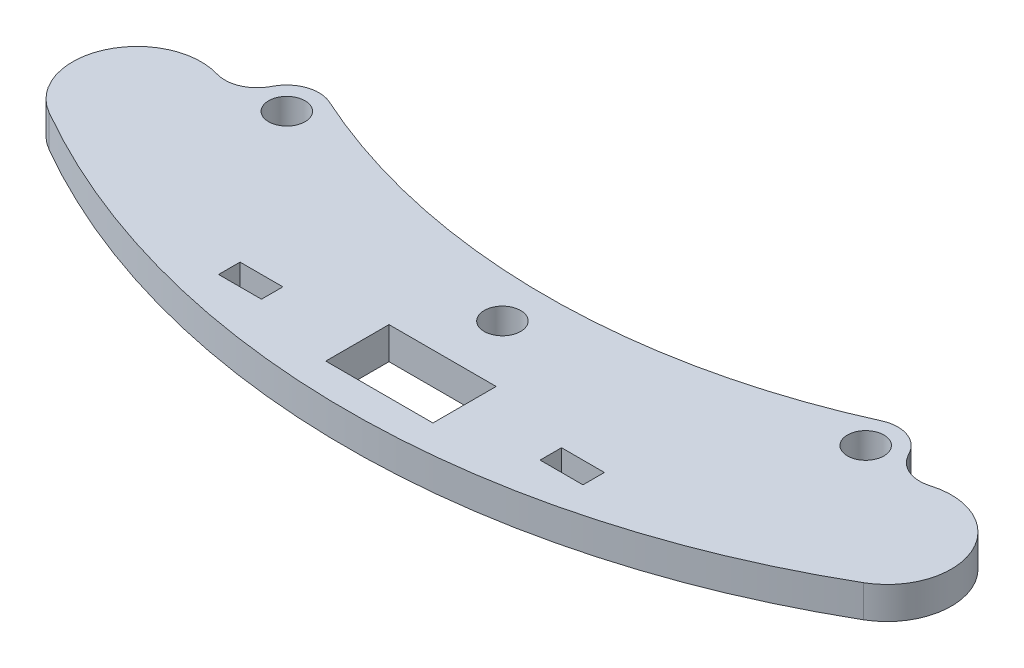
ISO-10303-21;
HEADER;
FILE_DESCRIPTION(('STEP AP214'),'2;1');
FILE_NAME('part.step','',(''),(''),'','','');
FILE_SCHEMA(('AUTOMOTIVE_DESIGN { 1 0 10303 214 1 1 1 1 }'));
ENDSEC;
DATA;
#1=APPLICATION_CONTEXT('core data for automotive mechanical design processes');
#2=APPLICATION_PROTOCOL_DEFINITION('international standard','automotive_design',2000,#1);
#3=PRODUCT_CONTEXT('',#1,'mechanical');
#4=PRODUCT('Part','Part','',(#3));
#5=PRODUCT_RELATED_PRODUCT_CATEGORY('part','',(#4));
#6=PRODUCT_DEFINITION_FORMATION('','',#4);
#7=PRODUCT_DEFINITION_CONTEXT('part definition',#1,'design');
#8=PRODUCT_DEFINITION('design','',#6,#7);
#9=PRODUCT_DEFINITION_SHAPE('','',#8);
#10=(LENGTH_UNIT() NAMED_UNIT(*) SI_UNIT(.MILLI.,.METRE.));
#11=(NAMED_UNIT(*) PLANE_ANGLE_UNIT() SI_UNIT($,.RADIAN.));
#12=(NAMED_UNIT(*) SI_UNIT($,.STERADIAN.) SOLID_ANGLE_UNIT());
#13=UNCERTAINTY_MEASURE_WITH_UNIT(LENGTH_MEASURE(1.E-05),#10,'distance_accuracy_value','');
#14=(GEOMETRIC_REPRESENTATION_CONTEXT(3) GLOBAL_UNCERTAINTY_ASSIGNED_CONTEXT((#13)) GLOBAL_UNIT_ASSIGNED_CONTEXT((#10,
#11,#12)) REPRESENTATION_CONTEXT('',''));
#15=CARTESIAN_POINT('',(0.,0.,0.));
#16=DIRECTION('',(0.,0.,1.));
#17=DIRECTION('',(1.,0.,0.));
#18=AXIS2_PLACEMENT_3D('',#15,#16,#17);
#19=CARTESIAN_POINT('',(-34.9999999999997,3.,60.6217782649109));
#20=DIRECTION('',(0.,1.,0.));
#21=DIRECTION('',(0.,0.,1.));
#22=AXIS2_PLACEMENT_3D('',#19,#20,#21);
#23=PLANE('',#22);
#24=DIRECTION('',(-1.,0.,0.));
#25=VECTOR('',#24,1.);
#26=CARTESIAN_POINT('',(17.0000000000005,3.,71.0000000000001));
#27=LINE('',#26,#25);
#28=CARTESIAN_POINT('',(17.0000000000005,3.,71.0000000000001));
#29=VERTEX_POINT('',#28);
#30=CARTESIAN_POINT('',(13.0000000000005,3.,71.0000000000001));
#31=VERTEX_POINT('',#30);
#32=EDGE_CURVE('E226',#29,#31,#27,.T.);
#33=ORIENTED_EDGE('',*,*,#32,.T.);
#34=DIRECTION('',(0.,0.,-1.));
#35=VECTOR('',#34,1.);
#36=CARTESIAN_POINT('',(13.0000000000005,3.,71.0000000000001));
#37=LINE('',#36,#35);
#38=CARTESIAN_POINT('',(13.0000000000005,3.,69.0000000000001));
#39=VERTEX_POINT('',#38);
#40=EDGE_CURVE('E242',#31,#39,#37,.T.);
#41=ORIENTED_EDGE('',*,*,#40,.T.);
#42=DIRECTION('',(1.,0.,0.));
#43=VECTOR('',#42,1.);
#44=CARTESIAN_POINT('',(17.0000000000005,3.,69.0000000000001));
#45=LINE('',#44,#43);
#46=CARTESIAN_POINT('',(17.0000000000005,3.,69.0000000000001));
#47=VERTEX_POINT('',#46);
#48=EDGE_CURVE('E220',#39,#47,#45,.T.);
#49=ORIENTED_EDGE('',*,*,#48,.T.);
#50=DIRECTION('',(0.,0.,1.));
#51=VECTOR('',#50,1.);
#52=CARTESIAN_POINT('',(17.0000000000005,3.,71.0000000000001));
#53=LINE('',#52,#51);
#54=EDGE_CURVE('E223',#47,#29,#53,.T.);
#55=ORIENTED_EDGE('',*,*,#54,.T.);
#56=EDGE_LOOP('',(#33,#41,#49,#55));
#57=FACE_BOUND('',#56,.T.);
#58=DIRECTION('',(0.,0.,1.));
#59=VECTOR('',#58,1.);
#60=CARTESIAN_POINT('',(-13.,3.,71.));
#61=LINE('',#60,#59);
#62=CARTESIAN_POINT('',(-13.,3.,69.));
#63=VERTEX_POINT('',#62);
#64=CARTESIAN_POINT('',(-13.,3.,71.));
#65=VERTEX_POINT('',#64);
#66=EDGE_CURVE('E194',#63,#65,#61,.T.);
#67=ORIENTED_EDGE('',*,*,#66,.T.);
#68=DIRECTION('',(-1.,0.,0.));
#69=VECTOR('',#68,1.);
#70=CARTESIAN_POINT('',(-17.,3.,71.));
#71=LINE('',#70,#69);
#72=CARTESIAN_POINT('',(-17.,3.,71.));
#73=VERTEX_POINT('',#72);
#74=EDGE_CURVE('E181',#65,#73,#71,.T.);
#75=ORIENTED_EDGE('',*,*,#74,.T.);
#76=DIRECTION('',(0.,0.,-1.));
#77=VECTOR('',#76,1.);
#78=CARTESIAN_POINT('',(-17.,3.,71.));
#79=LINE('',#78,#77);
#80=CARTESIAN_POINT('',(-17.,3.,69.));
#81=VERTEX_POINT('',#80);
#82=EDGE_CURVE('E206',#73,#81,#79,.T.);
#83=ORIENTED_EDGE('',*,*,#82,.T.);
#84=DIRECTION('',(1.,0.,0.));
#85=VECTOR('',#84,1.);
#86=CARTESIAN_POINT('',(-17.,3.,69.));
#87=LINE('',#86,#85);
#88=EDGE_CURVE('E202',#81,#63,#87,.T.);
#89=ORIENTED_EDGE('',*,*,#88,.T.);
#90=EDGE_LOOP('',(#67,#75,#83,#89));
#91=FACE_BOUND('',#90,.T.);
#92=DIRECTION('',(0.,0.,1.));
#93=VECTOR('',#92,1.);
#94=CARTESIAN_POINT('',(5.00000000000026,3.,73.));
#95=LINE('',#94,#93);
#96=CARTESIAN_POINT('',(5.00000000000026,3.,67.1));
#97=VERTEX_POINT('',#96);
#98=CARTESIAN_POINT('',(5.00000000000026,3.,73.));
#99=VERTEX_POINT('',#98);
#100=EDGE_CURVE('E255',#97,#99,#95,.T.);
#101=ORIENTED_EDGE('',*,*,#100,.T.);
#102=DIRECTION('',(-1.,0.,0.));
#103=VECTOR('',#102,1.);
#104=CARTESIAN_POINT('',(-4.99999999999974,3.,73.));
#105=LINE('',#104,#103);
#106=CARTESIAN_POINT('',(-4.99999999999973,3.,73.));
#107=VERTEX_POINT('',#106);
#108=EDGE_CURVE('E272',#99,#107,#105,.T.);
#109=ORIENTED_EDGE('',*,*,#108,.T.);
#110=DIRECTION('',(0.,0.,-1.));
#111=VECTOR('',#110,1.);
#112=CARTESIAN_POINT('',(-4.99999999999974,3.,73.));
#113=LINE('',#112,#111);
#114=CARTESIAN_POINT('',(-4.99999999999974,3.,67.1));
#115=VERTEX_POINT('',#114);
#116=EDGE_CURVE('E189',#107,#115,#113,.T.);
#117=ORIENTED_EDGE('',*,*,#116,.T.);
#118=DIRECTION('',(1.,0.,0.));
#119=VECTOR('',#118,1.);
#120=CARTESIAN_POINT('',(-4.99999999999974,3.,67.1));
#121=LINE('',#120,#119);
#122=EDGE_CURVE('E252',#115,#97,#121,.T.);
#123=ORIENTED_EDGE('',*,*,#122,.T.);
#124=EDGE_LOOP('',(#101,#109,#117,#123));
#125=FACE_BOUND('',#124,.T.);
#126=CARTESIAN_POINT('',(-4.19109191795997E-12,3.,61.5151302624379));
#127=DIRECTION('',(0.,1.,0.));
#128=DIRECTION('',(0.,0.,1.));
#129=AXIS2_PLACEMENT_3D('',#126,#127,#128);
#130=CIRCLE('',#129,1.70000000000389);
#131=CARTESIAN_POINT('',(-4.19109191795997E-12,3.,63.2151302624418));
#132=VERTEX_POINT('',#131);
#133=EDGE_CURVE('E288',#132,#132,#130,.T.);
#134=ORIENTED_EDGE('',*,*,#133,.F.);
#135=EDGE_LOOP('',(#134));
#136=FACE_BOUND('',#135,.T.);
#137=CARTESIAN_POINT('',(-34.9999999999997,3.,60.6217782649109));
#138=DIRECTION('',(0.,1.,0.));
#139=DIRECTION('',(0.,0.,1.));
#140=AXIS2_PLACEMENT_3D('',#137,#138,#139);
#141=CIRCLE('',#140,6.00000000000001);
#142=CARTESIAN_POINT('',(-33.2800865650844,3.,54.8735700417862));
#143=VERTEX_POINT('',#142);
#144=CARTESIAN_POINT('',(-37.9999999999997,3.,65.8179306876175));
#145=VERTEX_POINT('',#144);
#146=EDGE_CURVE('E300',#143,#145,#141,.T.);
#147=ORIENTED_EDGE('',*,*,#146,.T.);
#148=CARTESIAN_POINT('',(0.,3.,2.42861286636753E-13));
#149=DIRECTION('',(0.,1.,0.));
#150=DIRECTION('',(0.,0.,1.));
#151=AXIS2_PLACEMENT_3D('',#148,#149,#150);
#152=CIRCLE('',#151,75.9999999999998);
#153=CARTESIAN_POINT('',(38.0000000000001,3.,65.8179306876173));
#154=VERTEX_POINT('',#153);
#155=EDGE_CURVE('E303',#145,#154,#152,.T.);
#156=ORIENTED_EDGE('',*,*,#155,.T.);
#157=CARTESIAN_POINT('',(35.0000000000001,3.,60.6217782649107));
#158=DIRECTION('',(0.,1.,0.));
#159=DIRECTION('',(0.,0.,1.));
#160=AXIS2_PLACEMENT_3D('',#157,#158,#159);
#161=CIRCLE('',#160,6.);
#162=CARTESIAN_POINT('',(33.2800865650846,3.,54.873570041786));
#163=VERTEX_POINT('',#162);
#164=EDGE_CURVE('E306',#154,#163,#161,.T.);
#165=ORIENTED_EDGE('',*,*,#164,.T.);
#166=CARTESIAN_POINT('',(32.4201298476269,3.,51.9994659302237));
#167=DIRECTION('',(0.,-1.,0.));
#168=DIRECTION('',(0.,0.,1.));
#169=AXIS2_PLACEMENT_3D('',#166,#167,#168);
#170=CIRCLE('',#169,3.);
#171=CARTESIAN_POINT('',(29.8220536362736,3.,53.4994659302238));
#172=VERTEX_POINT('',#171);
#173=EDGE_CURVE('E308',#163,#172,#170,.T.);
#174=ORIENTED_EDGE('',*,*,#173,.T.);
#175=DIRECTION('',(-0.499999999999996,0.,-0.866025403784441));
#176=VECTOR('',#175,1.);
#177=CARTESIAN_POINT('',(29.6071078981258,3.,53.1271689908813));
#178=LINE('',#177,#176);
#179=CARTESIAN_POINT('',(29.6071078981258,3.,53.1271689908813));
#180=VERTEX_POINT('',#179);
#181=EDGE_CURVE('E310',#172,#180,#178,.T.);
#182=ORIENTED_EDGE('',*,*,#181,.T.);
#183=CARTESIAN_POINT('',(27.0090316867723,3.,54.6271689908816));
#184=DIRECTION('',(0.,1.,0.));
#185=DIRECTION('',(0.,0.,1.));
#186=AXIS2_PLACEMENT_3D('',#183,#184,#185);
#187=CIRCLE('',#186,3.00000000000026);
#188=CARTESIAN_POINT('',(25.8239032892173,3.,51.8711808411774));
#189=VERTEX_POINT('',#188);
#190=EDGE_CURVE('E312',#180,#189,#187,.T.);
#191=ORIENTED_EDGE('',*,*,#190,.T.);
#192=CARTESIAN_POINT('',(1.24390822984244E-13,3.,-5.00852889084444));
#193=DIRECTION('',(0.,-1.,0.));
#194=DIRECTION('',(0.,0.,1.));
#195=AXIS2_PLACEMENT_3D('',#192,#193,#194);
#196=CIRCLE('',#195,62.4673943773061);
#197=CARTESIAN_POINT('',(-25.8239032892168,3.,51.8711808411775));
#198=VERTEX_POINT('',#197);
#199=EDGE_CURVE('E314',#189,#198,#196,.T.);
#200=ORIENTED_EDGE('',*,*,#199,.T.);
#201=CARTESIAN_POINT('',(-27.0090316867729,3.,54.6271689908812));
#202=DIRECTION('',(0.,1.,0.));
#203=DIRECTION('',(0.,0.,-1.));
#204=AXIS2_PLACEMENT_3D('',#201,#202,#203);
#205=CIRCLE('',#204,3.00000000000005);
#206=CARTESIAN_POINT('',(-29.6071078981262,3.,53.1271689908811));
#207=VERTEX_POINT('',#206);
#208=EDGE_CURVE('E316',#198,#207,#205,.T.);
#209=ORIENTED_EDGE('',*,*,#208,.T.);
#210=DIRECTION('',(-0.500000000000002,0.,0.866025403784438));
#211=VECTOR('',#210,1.);
#212=CARTESIAN_POINT('',(-29.607107898126,3.,53.1271689908812));
#213=LINE('',#212,#211);
#214=CARTESIAN_POINT('',(-29.8220536362738,3.,53.4994659302235));
#215=VERTEX_POINT('',#214);
#216=EDGE_CURVE('E318',#207,#215,#213,.T.);
#217=ORIENTED_EDGE('',*,*,#216,.T.);
#218=CARTESIAN_POINT('',(-32.4201298476273,3.,51.9994659302236));
#219=DIRECTION('',(0.,-1.,0.));
#220=DIRECTION('',(0.,0.,-1.));
#221=AXIS2_PLACEMENT_3D('',#218,#219,#220);
#222=CIRCLE('',#221,3.00000000000014);
#223=EDGE_CURVE('E320',#215,#143,#222,.T.);
#224=ORIENTED_EDGE('',*,*,#223,.T.);
#225=EDGE_LOOP('',(#147,#156,#165,#174,#182,#191,#200,#209,#217,#224));
#226=FACE_BOUND('',#225,.T.);
#227=CARTESIAN_POINT('',(27.0090316867723,3.,54.6271689908816));
#228=DIRECTION('',(0.,1.,0.));
#229=DIRECTION('',(0.,0.,1.));
#230=AXIS2_PLACEMENT_3D('',#227,#228,#229);
#231=CIRCLE('',#230,1.70000000000025);
#232=CARTESIAN_POINT('',(27.0090316867723,3.,56.3271689908819));
#233=VERTEX_POINT('',#232);
#234=EDGE_CURVE('E294',#233,#233,#231,.T.);
#235=ORIENTED_EDGE('',*,*,#234,.F.);
#236=EDGE_LOOP('',(#235));
#237=FACE_BOUND('',#236,.T.);
#238=CARTESIAN_POINT('',(-27.0090316867729,3.,54.6271689908812));
#239=DIRECTION('',(0.,1.,0.));
#240=DIRECTION('',(0.,0.,1.));
#241=AXIS2_PLACEMENT_3D('',#238,#239,#240);
#242=CIRCLE('',#241,1.70000000000025);
#243=CARTESIAN_POINT('',(-27.0090316867729,3.,56.3271689908814));
#244=VERTEX_POINT('',#243);
#245=EDGE_CURVE('E282',#244,#244,#242,.T.);
#246=ORIENTED_EDGE('',*,*,#245,.F.);
#247=EDGE_LOOP('',(#246));
#248=FACE_BOUND('',#247,.T.);
#249=ADVANCED_FACE('F33',(#57,#91,#125,#136,#226,#237,#248),#23,.T.);
#250=CARTESIAN_POINT('',(-34.9999999999997,0.,60.6217782649109));
#251=DIRECTION('',(0.,1.,0.));
#252=DIRECTION('',(0.,0.,1.));
#253=AXIS2_PLACEMENT_3D('',#250,#251,#252);
#254=PLANE('',#253);
#255=DIRECTION('',(0.,0.,-1.));
#256=VECTOR('',#255,1.);
#257=CARTESIAN_POINT('',(13.0000000000005,0.,71.0000000000001));
#258=LINE('',#257,#256);
#259=CARTESIAN_POINT('',(13.0000000000005,0.,71.0000000000001));
#260=VERTEX_POINT('',#259);
#261=CARTESIAN_POINT('',(13.0000000000005,0.,69.0000000000001));
#262=VERTEX_POINT('',#261);
#263=EDGE_CURVE('E231',#260,#262,#258,.T.);
#264=ORIENTED_EDGE('',*,*,#263,.F.);
#265=DIRECTION('',(-1.,0.,0.));
#266=VECTOR('',#265,1.);
#267=CARTESIAN_POINT('',(17.0000000000005,0.,71.0000000000001));
#268=LINE('',#267,#266);
#269=CARTESIAN_POINT('',(17.0000000000005,0.,71.0000000000001));
#270=VERTEX_POINT('',#269);
#271=EDGE_CURVE('E229',#270,#260,#268,.T.);
#272=ORIENTED_EDGE('',*,*,#271,.F.);
#273=DIRECTION('',(0.,0.,1.));
#274=VECTOR('',#273,1.);
#275=CARTESIAN_POINT('',(17.0000000000005,0.,71.0000000000001));
#276=LINE('',#275,#274);
#277=CARTESIAN_POINT('',(17.0000000000005,0.,69.0000000000001));
#278=VERTEX_POINT('',#277);
#279=EDGE_CURVE('E236',#278,#270,#276,.T.);
#280=ORIENTED_EDGE('',*,*,#279,.F.);
#281=DIRECTION('',(1.,0.,0.));
#282=VECTOR('',#281,1.);
#283=CARTESIAN_POINT('',(17.0000000000005,0.,69.0000000000001));
#284=LINE('',#283,#282);
#285=EDGE_CURVE('E233',#262,#278,#284,.T.);
#286=ORIENTED_EDGE('',*,*,#285,.F.);
#287=EDGE_LOOP('',(#264,#272,#280,#286));
#288=FACE_BOUND('',#287,.T.);
#289=DIRECTION('',(-1.,0.,0.));
#290=VECTOR('',#289,1.);
#291=CARTESIAN_POINT('',(-17.,0.,71.));
#292=LINE('',#291,#290);
#293=CARTESIAN_POINT('',(-13.,0.,71.));
#294=VERTEX_POINT('',#293);
#295=CARTESIAN_POINT('',(-17.,0.,71.));
#296=VERTEX_POINT('',#295);
#297=EDGE_CURVE('E204',#294,#296,#292,.T.);
#298=ORIENTED_EDGE('',*,*,#297,.F.);
#299=DIRECTION('',(0.,0.,1.));
#300=VECTOR('',#299,1.);
#301=CARTESIAN_POINT('',(-13.,0.,71.));
#302=LINE('',#301,#300);
#303=CARTESIAN_POINT('',(-13.,0.,69.));
#304=VERTEX_POINT('',#303);
#305=EDGE_CURVE('E197',#304,#294,#302,.T.);
#306=ORIENTED_EDGE('',*,*,#305,.F.);
#307=DIRECTION('',(1.,0.,0.));
#308=VECTOR('',#307,1.);
#309=CARTESIAN_POINT('',(-17.,0.,69.));
#310=LINE('',#309,#308);
#311=CARTESIAN_POINT('',(-17.,0.,69.));
#312=VERTEX_POINT('',#311);
#313=EDGE_CURVE('E198',#312,#304,#310,.T.);
#314=ORIENTED_EDGE('',*,*,#313,.F.);
#315=DIRECTION('',(0.,0.,-1.));
#316=VECTOR('',#315,1.);
#317=CARTESIAN_POINT('',(-17.,0.,71.));
#318=LINE('',#317,#316);
#319=EDGE_CURVE('E211',#296,#312,#318,.T.);
#320=ORIENTED_EDGE('',*,*,#319,.F.);
#321=EDGE_LOOP('',(#298,#306,#314,#320));
#322=FACE_BOUND('',#321,.T.);
#323=DIRECTION('',(-1.,0.,0.));
#324=VECTOR('',#323,1.);
#325=CARTESIAN_POINT('',(-4.99999999999974,0.,73.));
#326=LINE('',#325,#324);
#327=CARTESIAN_POINT('',(5.00000000000026,0.,73.));
#328=VERTEX_POINT('',#327);
#329=CARTESIAN_POINT('',(-4.99999999999974,0.,73.));
#330=VERTEX_POINT('',#329);
#331=EDGE_CURVE('E260',#328,#330,#326,.T.);
#332=ORIENTED_EDGE('',*,*,#331,.F.);
#333=DIRECTION('',(0.,0.,1.));
#334=VECTOR('',#333,1.);
#335=CARTESIAN_POINT('',(5.00000000000026,0.,73.));
#336=LINE('',#335,#334);
#337=CARTESIAN_POINT('',(5.00000000000026,0.,67.1));
#338=VERTEX_POINT('',#337);
#339=EDGE_CURVE('E258',#338,#328,#336,.T.);
#340=ORIENTED_EDGE('',*,*,#339,.F.);
#341=DIRECTION('',(1.,0.,0.));
#342=VECTOR('',#341,1.);
#343=CARTESIAN_POINT('',(-4.99999999999974,0.,67.1));
#344=LINE('',#343,#342);
#345=CARTESIAN_POINT('',(-4.99999999999974,0.,67.1));
#346=VERTEX_POINT('',#345);
#347=EDGE_CURVE('E266',#346,#338,#344,.T.);
#348=ORIENTED_EDGE('',*,*,#347,.F.);
#349=DIRECTION('',(0.,0.,-1.));
#350=VECTOR('',#349,1.);
#351=CARTESIAN_POINT('',(-4.99999999999974,0.,73.));
#352=LINE('',#351,#350);
#353=EDGE_CURVE('E263',#330,#346,#352,.T.);
#354=ORIENTED_EDGE('',*,*,#353,.F.);
#355=EDGE_LOOP('',(#332,#340,#348,#354));
#356=FACE_BOUND('',#355,.T.);
#357=CARTESIAN_POINT('',(-34.9999999999997,0.,60.6217782649109));
#358=DIRECTION('',(0.,1.,0.));
#359=DIRECTION('',(0.,0.,1.));
#360=AXIS2_PLACEMENT_3D('',#357,#358,#359);
#361=CIRCLE('',#360,6.00000000000001);
#362=CARTESIAN_POINT('',(-33.2800865650844,0.,54.8735700417862));
#363=VERTEX_POINT('',#362);
#364=CARTESIAN_POINT('',(-37.9999999999997,0.,65.8179306876175));
#365=VERTEX_POINT('',#364);
#366=EDGE_CURVE('E297',#363,#365,#361,.T.);
#367=ORIENTED_EDGE('',*,*,#366,.F.);
#368=CARTESIAN_POINT('',(-32.4201298476273,0.,51.9994659302236));
#369=DIRECTION('',(0.,-1.,0.));
#370=DIRECTION('',(0.,0.,-1.));
#371=AXIS2_PLACEMENT_3D('',#368,#369,#370);
#372=CIRCLE('',#371,3.00000000000014);
#373=CARTESIAN_POINT('',(-29.8220536362738,0.,53.4994659302235));
#374=VERTEX_POINT('',#373);
#375=EDGE_CURVE('E304',#374,#363,#372,.T.);
#376=ORIENTED_EDGE('',*,*,#375,.F.);
#377=DIRECTION('',(-0.500000000000002,0.,0.866025403784438));
#378=VECTOR('',#377,1.);
#379=CARTESIAN_POINT('',(-29.607107898126,0.,53.1271689908812));
#380=LINE('',#379,#378);
#381=CARTESIAN_POINT('',(-29.6071078981262,0.,53.1271689908811));
#382=VERTEX_POINT('',#381);
#383=EDGE_CURVE('E339',#382,#374,#380,.T.);
#384=ORIENTED_EDGE('',*,*,#383,.F.);
#385=CARTESIAN_POINT('',(-27.0090316867729,0.,54.6271689908812));
#386=DIRECTION('',(0.,1.,0.));
#387=DIRECTION('',(0.,0.,-1.));
#388=AXIS2_PLACEMENT_3D('',#385,#386,#387);
#389=CIRCLE('',#388,3.00000000000005);
#390=CARTESIAN_POINT('',(-25.8239032892168,0.,51.8711808411775));
#391=VERTEX_POINT('',#390);
#392=EDGE_CURVE('E337',#391,#382,#389,.T.);
#393=ORIENTED_EDGE('',*,*,#392,.F.);
#394=CARTESIAN_POINT('',(1.24390822984244E-13,0.,-5.00852889084444));
#395=DIRECTION('',(0.,-1.,0.));
#396=DIRECTION('',(0.,0.,1.));
#397=AXIS2_PLACEMENT_3D('',#394,#395,#396);
#398=CIRCLE('',#397,62.4673943773061);
#399=CARTESIAN_POINT('',(25.8239032892173,0.,51.8711808411774));
#400=VERTEX_POINT('',#399);
#401=EDGE_CURVE('E335',#400,#391,#398,.T.);
#402=ORIENTED_EDGE('',*,*,#401,.F.);
#403=CARTESIAN_POINT('',(27.0090316867723,0.,54.6271689908816));
#404=DIRECTION('',(0.,1.,0.));
#405=DIRECTION('',(0.,0.,1.));
#406=AXIS2_PLACEMENT_3D('',#403,#404,#405);
#407=CIRCLE('',#406,3.00000000000026);
#408=CARTESIAN_POINT('',(29.6071078981258,0.,53.1271689908813));
#409=VERTEX_POINT('',#408);
#410=EDGE_CURVE('E333',#409,#400,#407,.T.);
#411=ORIENTED_EDGE('',*,*,#410,.F.);
#412=DIRECTION('',(-0.499999999999996,0.,-0.866025403784441));
#413=VECTOR('',#412,1.);
#414=CARTESIAN_POINT('',(29.6071078981258,0.,53.1271689908813));
#415=LINE('',#414,#413);
#416=CARTESIAN_POINT('',(29.8220536362736,0.,53.4994659302238));
#417=VERTEX_POINT('',#416);
#418=EDGE_CURVE('E331',#417,#409,#415,.T.);
#419=ORIENTED_EDGE('',*,*,#418,.F.);
#420=CARTESIAN_POINT('',(32.4201298476269,0.,51.9994659302237));
#421=DIRECTION('',(0.,-1.,0.));
#422=DIRECTION('',(0.,0.,1.));
#423=AXIS2_PLACEMENT_3D('',#420,#421,#422);
#424=CIRCLE('',#423,3.);
#425=CARTESIAN_POINT('',(33.2800865650846,0.,54.873570041786));
#426=VERTEX_POINT('',#425);
#427=EDGE_CURVE('E329',#426,#417,#424,.T.);
#428=ORIENTED_EDGE('',*,*,#427,.F.);
#429=CARTESIAN_POINT('',(35.0000000000001,0.,60.6217782649107));
#430=DIRECTION('',(0.,1.,0.));
#431=DIRECTION('',(0.,0.,1.));
#432=AXIS2_PLACEMENT_3D('',#429,#430,#431);
#433=CIRCLE('',#432,6.);
#434=CARTESIAN_POINT('',(38.0000000000001,0.,65.8179306876173));
#435=VERTEX_POINT('',#434);
#436=EDGE_CURVE('E327',#435,#426,#433,.T.);
#437=ORIENTED_EDGE('',*,*,#436,.F.);
#438=CARTESIAN_POINT('',(0.,0.,2.42861286636753E-13));
#439=DIRECTION('',(0.,1.,0.));
#440=DIRECTION('',(0.,0.,1.));
#441=AXIS2_PLACEMENT_3D('',#438,#439,#440);
#442=CIRCLE('',#441,75.9999999999998);
#443=EDGE_CURVE('E325',#365,#435,#442,.T.);
#444=ORIENTED_EDGE('',*,*,#443,.F.);
#445=EDGE_LOOP('',(#367,#376,#384,#393,#402,#411,#419,#428,#437,#444));
#446=FACE_BOUND('',#445,.T.);
#447=CARTESIAN_POINT('',(27.0090316867723,0.,54.6271689908816));
#448=DIRECTION('',(0.,1.,0.));
#449=DIRECTION('',(0.,0.,1.));
#450=AXIS2_PLACEMENT_3D('',#447,#448,#449);
#451=CIRCLE('',#450,1.70000000000025);
#452=CARTESIAN_POINT('',(27.0090316867723,0.,56.3271689908819));
#453=VERTEX_POINT('',#452);
#454=EDGE_CURVE('E291',#453,#453,#451,.T.);
#455=ORIENTED_EDGE('',*,*,#454,.T.);
#456=EDGE_LOOP('',(#455));
#457=FACE_BOUND('',#456,.T.);
#458=CARTESIAN_POINT('',(-4.19109191795997E-12,0.,61.5151302624379));
#459=DIRECTION('',(0.,1.,0.));
#460=DIRECTION('',(0.,0.,1.));
#461=AXIS2_PLACEMENT_3D('',#458,#459,#460);
#462=CIRCLE('',#461,1.70000000000389);
#463=CARTESIAN_POINT('',(-4.19109191795997E-12,0.,63.2151302624418));
#464=VERTEX_POINT('',#463);
#465=EDGE_CURVE('E285',#464,#464,#462,.T.);
#466=ORIENTED_EDGE('',*,*,#465,.T.);
#467=EDGE_LOOP('',(#466));
#468=FACE_BOUND('',#467,.T.);
#469=CARTESIAN_POINT('',(-27.0090316867729,0.,54.6271689908812));
#470=DIRECTION('',(0.,1.,0.));
#471=DIRECTION('',(0.,0.,1.));
#472=AXIS2_PLACEMENT_3D('',#469,#470,#471);
#473=CIRCLE('',#472,1.70000000000025);
#474=CARTESIAN_POINT('',(-27.0090316867729,0.,56.3271689908814));
#475=VERTEX_POINT('',#474);
#476=EDGE_CURVE('E281',#475,#475,#473,.T.);
#477=ORIENTED_EDGE('',*,*,#476,.T.);
#478=EDGE_LOOP('',(#477));
#479=FACE_BOUND('',#478,.T.);
#480=ADVANCED_FACE('F375',(#288,#322,#356,#446,#457,#468,#479),#254,.F.);
#481=CARTESIAN_POINT('',(-34.9999999999997,3.,60.6217782649109));
#482=DIRECTION('',(0.,-1.,0.));
#483=DIRECTION('',(0.,0.,-1.));
#484=AXIS2_PLACEMENT_3D('',#481,#482,#483);
#485=CYLINDRICAL_SURFACE('',#484,6.00000000000001);
#486=ORIENTED_EDGE('',*,*,#366,.T.);
#487=DIRECTION('',(0.,-1.,0.));
#488=VECTOR('',#487,1.);
#489=CARTESIAN_POINT('',(-37.9999999999997,3.,65.8179306876175));
#490=LINE('',#489,#488);
#491=EDGE_CURVE('E11',#145,#365,#490,.T.);
#492=ORIENTED_EDGE('',*,*,#491,.F.);
#493=ORIENTED_EDGE('',*,*,#146,.F.);
#494=DIRECTION('',(0.,-1.,0.));
#495=VECTOR('',#494,1.);
#496=CARTESIAN_POINT('',(-33.2800865650844,3.,54.8735700417862));
#497=LINE('',#496,#495);
#498=EDGE_CURVE('E322',#143,#363,#497,.T.);
#499=ORIENTED_EDGE('',*,*,#498,.T.);
#500=EDGE_LOOP('',(#486,#492,#493,#499));
#501=FACE_BOUND('',#500,.T.);
#502=ADVANCED_FACE('F35',(#501),#485,.T.);
#503=CARTESIAN_POINT('',(0.,3.,2.42861286636753E-13));
#504=DIRECTION('',(0.,-1.,0.));
#505=DIRECTION('',(0.,0.,-1.));
#506=AXIS2_PLACEMENT_3D('',#503,#504,#505);
#507=CYLINDRICAL_SURFACE('',#506,75.9999999999998);
#508=ORIENTED_EDGE('',*,*,#443,.T.);
#509=DIRECTION('',(0.,-1.,0.));
#510=VECTOR('',#509,1.);
#511=CARTESIAN_POINT('',(38.0000000000001,3.,65.8179306876173));
#512=LINE('',#511,#510);
#513=EDGE_CURVE('E41',#154,#435,#512,.T.);
#514=ORIENTED_EDGE('',*,*,#513,.F.);
#515=ORIENTED_EDGE('',*,*,#155,.F.);
#516=ORIENTED_EDGE('',*,*,#491,.T.);
#517=EDGE_LOOP('',(#508,#514,#515,#516));
#518=FACE_BOUND('',#517,.T.);
#519=ADVANCED_FACE('F393',(#518),#507,.T.);
#520=CARTESIAN_POINT('',(35.0000000000001,3.,60.6217782649107));
#521=DIRECTION('',(0.,-1.,0.));
#522=DIRECTION('',(0.,0.,-1.));
#523=AXIS2_PLACEMENT_3D('',#520,#521,#522);
#524=CYLINDRICAL_SURFACE('',#523,6.);
#525=ORIENTED_EDGE('',*,*,#436,.T.);
#526=DIRECTION('',(0.,-1.,0.));
#527=VECTOR('',#526,1.);
#528=CARTESIAN_POINT('',(33.2800865650846,3.,54.873570041786));
#529=LINE('',#528,#527);
#530=EDGE_CURVE('E362',#163,#426,#529,.T.);
#531=ORIENTED_EDGE('',*,*,#530,.F.);
#532=ORIENTED_EDGE('',*,*,#164,.F.);
#533=ORIENTED_EDGE('',*,*,#513,.T.);
#534=EDGE_LOOP('',(#525,#531,#532,#533));
#535=FACE_BOUND('',#534,.T.);
#536=ADVANCED_FACE('F369',(#535),#524,.T.);
#537=CARTESIAN_POINT('',(32.4201298476269,3.,51.9994659302237));
#538=DIRECTION('',(0.,-1.,0.));
#539=DIRECTION('',(0.,0.,-1.));
#540=AXIS2_PLACEMENT_3D('',#537,#538,#539);
#541=CYLINDRICAL_SURFACE('',#540,3.);
#542=ORIENTED_EDGE('',*,*,#427,.T.);
#543=DIRECTION('',(0.,-1.,0.));
#544=VECTOR('',#543,1.);
#545=CARTESIAN_POINT('',(29.8220536362736,3.,53.4994659302238));
#546=LINE('',#545,#544);
#547=EDGE_CURVE('E359',#172,#417,#546,.T.);
#548=ORIENTED_EDGE('',*,*,#547,.F.);
#549=ORIENTED_EDGE('',*,*,#173,.F.);
#550=ORIENTED_EDGE('',*,*,#530,.T.);
#551=EDGE_LOOP('',(#542,#548,#549,#550));
#552=FACE_BOUND('',#551,.T.);
#553=ADVANCED_FACE('F381',(#552),#541,.F.);
#554=CARTESIAN_POINT('',(29.6071078981258,3.,53.1271689908813));
#555=DIRECTION('',(-0.866025403784441,0.,0.499999999999996));
#556=DIRECTION('',(0.499999999999996,0.,0.866025403784441));
#557=AXIS2_PLACEMENT_3D('',#554,#555,#556);
#558=PLANE('',#557);
#559=ORIENTED_EDGE('',*,*,#418,.T.);
#560=DIRECTION('',(0.,-1.,0.));
#561=VECTOR('',#560,1.);
#562=CARTESIAN_POINT('',(29.6071078981258,3.,53.1271689908813));
#563=LINE('',#562,#561);
#564=EDGE_CURVE('E356',#180,#409,#563,.T.);
#565=ORIENTED_EDGE('',*,*,#564,.F.);
#566=ORIENTED_EDGE('',*,*,#181,.F.);
#567=ORIENTED_EDGE('',*,*,#547,.T.);
#568=EDGE_LOOP('',(#559,#565,#566,#567));
#569=FACE_BOUND('',#568,.T.);
#570=ADVANCED_FACE('F385',(#569),#558,.F.);
#571=CARTESIAN_POINT('',(27.0090316867723,3.,54.6271689908816));
#572=DIRECTION('',(0.,-1.,0.));
#573=DIRECTION('',(0.,0.,-1.));
#574=AXIS2_PLACEMENT_3D('',#571,#572,#573);
#575=CYLINDRICAL_SURFACE('',#574,3.00000000000026);
#576=ORIENTED_EDGE('',*,*,#410,.T.);
#577=DIRECTION('',(0.,-1.,0.));
#578=VECTOR('',#577,1.);
#579=CARTESIAN_POINT('',(25.8239032892173,3.,51.8711808411774));
#580=LINE('',#579,#578);
#581=EDGE_CURVE('E353',#189,#400,#580,.T.);
#582=ORIENTED_EDGE('',*,*,#581,.F.);
#583=ORIENTED_EDGE('',*,*,#190,.F.);
#584=ORIENTED_EDGE('',*,*,#564,.T.);
#585=EDGE_LOOP('',(#576,#582,#583,#584));
#586=FACE_BOUND('',#585,.T.);
#587=ADVANCED_FACE('F416',(#586),#575,.T.);
#588=CARTESIAN_POINT('',(1.24390822984244E-13,3.,-5.00852889084444));
#589=DIRECTION('',(0.,-1.,0.));
#590=DIRECTION('',(0.,0.,-1.));
#591=AXIS2_PLACEMENT_3D('',#588,#589,#590);
#592=CYLINDRICAL_SURFACE('',#591,62.4673943773061);
#593=ORIENTED_EDGE('',*,*,#401,.T.);
#594=DIRECTION('',(0.,-1.,0.));
#595=VECTOR('',#594,1.);
#596=CARTESIAN_POINT('',(-25.8239032892168,3.,51.8711808411775));
#597=LINE('',#596,#595);
#598=EDGE_CURVE('E350',#198,#391,#597,.T.);
#599=ORIENTED_EDGE('',*,*,#598,.F.);
#600=ORIENTED_EDGE('',*,*,#199,.F.);
#601=ORIENTED_EDGE('',*,*,#581,.T.);
#602=EDGE_LOOP('',(#593,#599,#600,#601));
#603=FACE_BOUND('',#602,.T.);
#604=ADVANCED_FACE('F413',(#603),#592,.F.);
#605=CARTESIAN_POINT('',(-27.0090316867729,3.,54.6271689908812));
#606=DIRECTION('',(0.,-1.,0.));
#607=DIRECTION('',(0.,0.,-1.));
#608=AXIS2_PLACEMENT_3D('',#605,#606,#607);
#609=CYLINDRICAL_SURFACE('',#608,3.00000000000005);
#610=ORIENTED_EDGE('',*,*,#392,.T.);
#611=DIRECTION('',(0.,-1.,0.));
#612=VECTOR('',#611,1.);
#613=CARTESIAN_POINT('',(-29.6071078981262,3.,53.1271689908811));
#614=LINE('',#613,#612);
#615=EDGE_CURVE('E347',#207,#382,#614,.T.);
#616=ORIENTED_EDGE('',*,*,#615,.F.);
#617=ORIENTED_EDGE('',*,*,#208,.F.);
#618=ORIENTED_EDGE('',*,*,#598,.T.);
#619=EDGE_LOOP('',(#610,#616,#617,#618));
#620=FACE_BOUND('',#619,.T.);
#621=ADVANCED_FACE('F409',(#620),#609,.T.);
#622=CARTESIAN_POINT('',(-29.607107898126,3.,53.1271689908812));
#623=DIRECTION('',(0.866025403784438,0.,0.500000000000001));
#624=DIRECTION('',(0.500000000000002,0.,-0.866025403784438));
#625=AXIS2_PLACEMENT_3D('',#622,#623,#624);
#626=PLANE('',#625);
#627=ORIENTED_EDGE('',*,*,#383,.T.);
#628=DIRECTION('',(0.,-1.,0.));
#629=VECTOR('',#628,1.);
#630=CARTESIAN_POINT('',(-29.8220536362738,3.,53.4994659302235));
#631=LINE('',#630,#629);
#632=EDGE_CURVE('E344',#215,#374,#631,.T.);
#633=ORIENTED_EDGE('',*,*,#632,.F.);
#634=ORIENTED_EDGE('',*,*,#216,.F.);
#635=ORIENTED_EDGE('',*,*,#615,.T.);
#636=EDGE_LOOP('',(#627,#633,#634,#635));
#637=FACE_BOUND('',#636,.T.);
#638=ADVANCED_FACE('F405',(#637),#626,.F.);
#639=CARTESIAN_POINT('',(-32.4201298476273,3.,51.9994659302236));
#640=DIRECTION('',(0.,-1.,0.));
#641=DIRECTION('',(0.,0.,-1.));
#642=AXIS2_PLACEMENT_3D('',#639,#640,#641);
#643=CYLINDRICAL_SURFACE('',#642,3.00000000000014);
#644=ORIENTED_EDGE('',*,*,#375,.T.);
#645=ORIENTED_EDGE('',*,*,#498,.F.);
#646=ORIENTED_EDGE('',*,*,#223,.F.);
#647=ORIENTED_EDGE('',*,*,#632,.T.);
#648=EDGE_LOOP('',(#644,#645,#646,#647));
#649=FACE_BOUND('',#648,.T.);
#650=ADVANCED_FACE('F400',(#649),#643,.F.);
#651=CARTESIAN_POINT('',(27.0090316867723,3.,54.6271689908816));
#652=DIRECTION('',(0.,-1.,0.));
#653=DIRECTION('',(0.,0.,-1.));
#654=AXIS2_PLACEMENT_3D('',#651,#652,#653);
#655=CYLINDRICAL_SURFACE('',#654,1.70000000000025);
#656=ORIENTED_EDGE('',*,*,#234,.T.);
#657=EDGE_LOOP('',(#656));
#658=FACE_BOUND('',#657,.T.);
#659=ORIENTED_EDGE('',*,*,#454,.F.);
#660=EDGE_LOOP('',(#659));
#661=FACE_BOUND('',#660,.T.);
#662=ADVANCED_FACE('F434',(#658,#661),#655,.F.);
#663=CARTESIAN_POINT('',(-4.19109191795997E-12,3.,61.5151302624379));
#664=DIRECTION('',(0.,-1.,0.));
#665=DIRECTION('',(0.,0.,-1.));
#666=AXIS2_PLACEMENT_3D('',#663,#664,#665);
#667=CYLINDRICAL_SURFACE('',#666,1.70000000000389);
#668=ORIENTED_EDGE('',*,*,#133,.T.);
#669=EDGE_LOOP('',(#668));
#670=FACE_BOUND('',#669,.T.);
#671=ORIENTED_EDGE('',*,*,#465,.F.);
#672=EDGE_LOOP('',(#671));
#673=FACE_BOUND('',#672,.T.);
#674=ADVANCED_FACE('F460',(#670,#673),#667,.F.);
#675=CARTESIAN_POINT('',(-27.0090316867729,3.,54.6271689908812));
#676=DIRECTION('',(0.,-1.,0.));
#677=DIRECTION('',(0.,0.,-1.));
#678=AXIS2_PLACEMENT_3D('',#675,#676,#677);
#679=CYLINDRICAL_SURFACE('',#678,1.70000000000025);
#680=ORIENTED_EDGE('',*,*,#245,.T.);
#681=EDGE_LOOP('',(#680));
#682=FACE_BOUND('',#681,.T.);
#683=ORIENTED_EDGE('',*,*,#476,.F.);
#684=EDGE_LOOP('',(#683));
#685=FACE_BOUND('',#684,.T.);
#686=ADVANCED_FACE('F467',(#682,#685),#679,.F.);
#687=CARTESIAN_POINT('',(5.00000000000026,3.001,73.));
#688=DIRECTION('',(1.,0.,0.));
#689=DIRECTION('',(0.,0.,-1.));
#690=AXIS2_PLACEMENT_3D('',#687,#688,#689);
#691=PLANE('',#690);
#692=DIRECTION('',(0.,-1.,0.));
#693=VECTOR('',#692,1.);
#694=CARTESIAN_POINT('',(5.00000000000026,3.001,67.1));
#695=LINE('',#694,#693);
#696=EDGE_CURVE('E270',#97,#338,#695,.T.);
#697=ORIENTED_EDGE('',*,*,#696,.T.);
#698=ORIENTED_EDGE('',*,*,#339,.T.);
#699=DIRECTION('',(0.,-1.,0.));
#700=VECTOR('',#699,1.);
#701=CARTESIAN_POINT('',(5.00000000000026,3.001,73.));
#702=LINE('',#701,#700);
#703=EDGE_CURVE('E269',#99,#328,#702,.T.);
#704=ORIENTED_EDGE('',*,*,#703,.F.);
#705=ORIENTED_EDGE('',*,*,#100,.F.);
#706=EDGE_LOOP('',(#697,#698,#704,#705));
#707=FACE_BOUND('',#706,.T.);
#708=ADVANCED_FACE('F474',(#707),#691,.F.);
#709=CARTESIAN_POINT('',(-4.99999999999974,3.001,67.1));
#710=DIRECTION('',(0.,0.,-1.));
#711=DIRECTION('',(-1.,0.,0.));
#712=AXIS2_PLACEMENT_3D('',#709,#710,#711);
#713=PLANE('',#712);
#714=DIRECTION('',(0.,-1.,0.));
#715=VECTOR('',#714,1.);
#716=CARTESIAN_POINT('',(-4.99999999999974,3.001,67.1));
#717=LINE('',#716,#715);
#718=EDGE_CURVE('E273',#115,#346,#717,.T.);
#719=ORIENTED_EDGE('',*,*,#718,.T.);
#720=ORIENTED_EDGE('',*,*,#347,.T.);
#721=ORIENTED_EDGE('',*,*,#696,.F.);
#722=ORIENTED_EDGE('',*,*,#122,.F.);
#723=EDGE_LOOP('',(#719,#720,#721,#722));
#724=FACE_BOUND('',#723,.T.);
#725=ADVANCED_FACE('F482',(#724),#713,.F.);
#726=CARTESIAN_POINT('',(-4.99999999999974,3.001,73.));
#727=DIRECTION('',(-1.,0.,0.));
#728=DIRECTION('',(0.,0.,1.));
#729=AXIS2_PLACEMENT_3D('',#726,#727,#728);
#730=PLANE('',#729);
#731=DIRECTION('',(0.,-1.,0.));
#732=VECTOR('',#731,1.);
#733=CARTESIAN_POINT('',(-4.99999999999974,3.001,73.));
#734=LINE('',#733,#732);
#735=EDGE_CURVE('E275',#107,#330,#734,.T.);
#736=ORIENTED_EDGE('',*,*,#735,.T.);
#737=ORIENTED_EDGE('',*,*,#353,.T.);
#738=ORIENTED_EDGE('',*,*,#718,.F.);
#739=ORIENTED_EDGE('',*,*,#116,.F.);
#740=EDGE_LOOP('',(#736,#737,#738,#739));
#741=FACE_BOUND('',#740,.T.);
#742=ADVANCED_FACE('F491',(#741),#730,.F.);
#743=CARTESIAN_POINT('',(-4.99999999999974,3.001,73.));
#744=DIRECTION('',(0.,0.,1.));
#745=DIRECTION('',(1.,0.,0.));
#746=AXIS2_PLACEMENT_3D('',#743,#744,#745);
#747=PLANE('',#746);
#748=ORIENTED_EDGE('',*,*,#703,.T.);
#749=ORIENTED_EDGE('',*,*,#331,.T.);
#750=ORIENTED_EDGE('',*,*,#735,.F.);
#751=ORIENTED_EDGE('',*,*,#108,.F.);
#752=EDGE_LOOP('',(#748,#749,#750,#751));
#753=FACE_BOUND('',#752,.T.);
#754=ADVANCED_FACE('F499',(#753),#747,.F.);
#755=CARTESIAN_POINT('',(-13.,3.001,71.));
#756=DIRECTION('',(1.,0.,0.));
#757=DIRECTION('',(0.,0.,-1.));
#758=AXIS2_PLACEMENT_3D('',#755,#756,#757);
#759=PLANE('',#758);
#760=DIRECTION('',(0.,-1.,0.));
#761=VECTOR('',#760,1.);
#762=CARTESIAN_POINT('',(-13.,3.001,69.));
#763=LINE('',#762,#761);
#764=EDGE_CURVE('E190',#63,#304,#763,.T.);
#765=ORIENTED_EDGE('',*,*,#764,.T.);
#766=ORIENTED_EDGE('',*,*,#305,.T.);
#767=DIRECTION('',(0.,-1.,0.));
#768=VECTOR('',#767,1.);
#769=CARTESIAN_POINT('',(-13.,3.001,71.));
#770=LINE('',#769,#768);
#771=EDGE_CURVE('E184',#65,#294,#770,.T.);
#772=ORIENTED_EDGE('',*,*,#771,.F.);
#773=ORIENTED_EDGE('',*,*,#66,.F.);
#774=EDGE_LOOP('',(#765,#766,#772,#773));
#775=FACE_BOUND('',#774,.T.);
#776=ADVANCED_FACE('F193',(#775),#759,.F.);
#777=CARTESIAN_POINT('',(-17.,3.001,69.));
#778=DIRECTION('',(0.,0.,-1.));
#779=DIRECTION('',(-1.,0.,0.));
#780=AXIS2_PLACEMENT_3D('',#777,#778,#779);
#781=PLANE('',#780);
#782=DIRECTION('',(0.,-1.,0.));
#783=VECTOR('',#782,1.);
#784=CARTESIAN_POINT('',(-17.,3.001,69.));
#785=LINE('',#784,#783);
#786=EDGE_CURVE('E217',#81,#312,#785,.T.);
#787=ORIENTED_EDGE('',*,*,#786,.T.);
#788=ORIENTED_EDGE('',*,*,#313,.T.);
#789=ORIENTED_EDGE('',*,*,#764,.F.);
#790=ORIENTED_EDGE('',*,*,#88,.F.);
#791=EDGE_LOOP('',(#787,#788,#789,#790));
#792=FACE_BOUND('',#791,.T.);
#793=ADVANCED_FACE('F514',(#792),#781,.F.);
#794=CARTESIAN_POINT('',(-17.,3.001,71.));
#795=DIRECTION('',(-1.,0.,0.));
#796=DIRECTION('',(0.,0.,1.));
#797=AXIS2_PLACEMENT_3D('',#794,#795,#796);
#798=PLANE('',#797);
#799=DIRECTION('',(0.,-1.,0.));
#800=VECTOR('',#799,1.);
#801=CARTESIAN_POINT('',(-17.,3.001,71.));
#802=LINE('',#801,#800);
#803=EDGE_CURVE('E56',#73,#296,#802,.T.);
#804=ORIENTED_EDGE('',*,*,#803,.T.);
#805=ORIENTED_EDGE('',*,*,#319,.T.);
#806=ORIENTED_EDGE('',*,*,#786,.F.);
#807=ORIENTED_EDGE('',*,*,#82,.F.);
#808=EDGE_LOOP('',(#804,#805,#806,#807));
#809=FACE_BOUND('',#808,.T.);
#810=ADVANCED_FACE('F521',(#809),#798,.F.);
#811=CARTESIAN_POINT('',(-17.,3.001,71.));
#812=DIRECTION('',(0.,0.,1.));
#813=DIRECTION('',(1.,0.,0.));
#814=AXIS2_PLACEMENT_3D('',#811,#812,#813);
#815=PLANE('',#814);
#816=ORIENTED_EDGE('',*,*,#771,.T.);
#817=ORIENTED_EDGE('',*,*,#297,.T.);
#818=ORIENTED_EDGE('',*,*,#803,.F.);
#819=ORIENTED_EDGE('',*,*,#74,.F.);
#820=EDGE_LOOP('',(#816,#817,#818,#819));
#821=FACE_BOUND('',#820,.T.);
#822=ADVANCED_FACE('F183',(#821),#815,.F.);
#823=CARTESIAN_POINT('',(17.0000000000005,3.001,71.0000000000001));
#824=DIRECTION('',(0.,0.,1.));
#825=DIRECTION('',(1.,0.,0.));
#826=AXIS2_PLACEMENT_3D('',#823,#824,#825);
#827=PLANE('',#826);
#828=DIRECTION('',(0.,-1.,0.));
#829=VECTOR('',#828,1.);
#830=CARTESIAN_POINT('',(17.0000000000005,3.001,71.0000000000001));
#831=LINE('',#830,#829);
#832=EDGE_CURVE('E240',#29,#270,#831,.T.);
#833=ORIENTED_EDGE('',*,*,#832,.T.);
#834=ORIENTED_EDGE('',*,*,#271,.T.);
#835=DIRECTION('',(0.,-1.,0.));
#836=VECTOR('',#835,1.);
#837=CARTESIAN_POINT('',(13.0000000000005,3.001,71.0000000000001));
#838=LINE('',#837,#836);
#839=EDGE_CURVE('E239',#31,#260,#838,.T.);
#840=ORIENTED_EDGE('',*,*,#839,.F.);
#841=ORIENTED_EDGE('',*,*,#32,.F.);
#842=EDGE_LOOP('',(#833,#834,#840,#841));
#843=FACE_BOUND('',#842,.T.);
#844=ADVANCED_FACE('F536',(#843),#827,.F.);
#845=CARTESIAN_POINT('',(17.0000000000005,3.001,71.0000000000001));
#846=DIRECTION('',(1.,0.,0.));
#847=DIRECTION('',(0.,0.,-1.));
#848=AXIS2_PLACEMENT_3D('',#845,#846,#847);
#849=PLANE('',#848);
#850=DIRECTION('',(0.,-1.,0.));
#851=VECTOR('',#850,1.);
#852=CARTESIAN_POINT('',(17.0000000000005,3.001,69.0000000000001));
#853=LINE('',#852,#851);
#854=EDGE_CURVE('E243',#47,#278,#853,.T.);
#855=ORIENTED_EDGE('',*,*,#854,.T.);
#856=ORIENTED_EDGE('',*,*,#279,.T.);
#857=ORIENTED_EDGE('',*,*,#832,.F.);
#858=ORIENTED_EDGE('',*,*,#54,.F.);
#859=EDGE_LOOP('',(#855,#856,#857,#858));
#860=FACE_BOUND('',#859,.T.);
#861=ADVANCED_FACE('F543',(#860),#849,.F.);
#862=CARTESIAN_POINT('',(17.0000000000005,3.001,69.0000000000001));
#863=DIRECTION('',(0.,0.,-1.));
#864=DIRECTION('',(-1.,0.,0.));
#865=AXIS2_PLACEMENT_3D('',#862,#863,#864);
#866=PLANE('',#865);
#867=DIRECTION('',(0.,-1.,0.));
#868=VECTOR('',#867,1.);
#869=CARTESIAN_POINT('',(13.0000000000005,3.001,69.0000000000001));
#870=LINE('',#869,#868);
#871=EDGE_CURVE('E48',#39,#262,#870,.T.);
#872=ORIENTED_EDGE('',*,*,#871,.T.);
#873=ORIENTED_EDGE('',*,*,#285,.T.);
#874=ORIENTED_EDGE('',*,*,#854,.F.);
#875=ORIENTED_EDGE('',*,*,#48,.F.);
#876=EDGE_LOOP('',(#872,#873,#874,#875));
#877=FACE_BOUND('',#876,.T.);
#878=ADVANCED_FACE('F551',(#877),#866,.F.);
#879=CARTESIAN_POINT('',(13.0000000000005,3.001,71.0000000000001));
#880=DIRECTION('',(-1.,0.,0.));
#881=DIRECTION('',(0.,0.,1.));
#882=AXIS2_PLACEMENT_3D('',#879,#880,#881);
#883=PLANE('',#882);
#884=ORIENTED_EDGE('',*,*,#839,.T.);
#885=ORIENTED_EDGE('',*,*,#263,.T.);
#886=ORIENTED_EDGE('',*,*,#871,.F.);
#887=ORIENTED_EDGE('',*,*,#40,.F.);
#888=EDGE_LOOP('',(#884,#885,#886,#887));
#889=FACE_BOUND('',#888,.T.);
#890=ADVANCED_FACE('F559',(#889),#883,.F.);
#891=CLOSED_SHELL('',(#249,#480,#502,#519,#536,#553,#570,#587,#604,#621,#638,#650,#662,#674,
#686,#708,#725,#742,#754,#776,#793,#810,#822,#844,#861,#878,#890));
#892=MANIFOLD_SOLID_BREP('B2',#891);
#893=ADVANCED_BREP_SHAPE_REPRESENTATION('',(#18,#892),#14);
#894=SHAPE_DEFINITION_REPRESENTATION(#9,#893);
ENDSEC;
END-ISO-10303-21;
